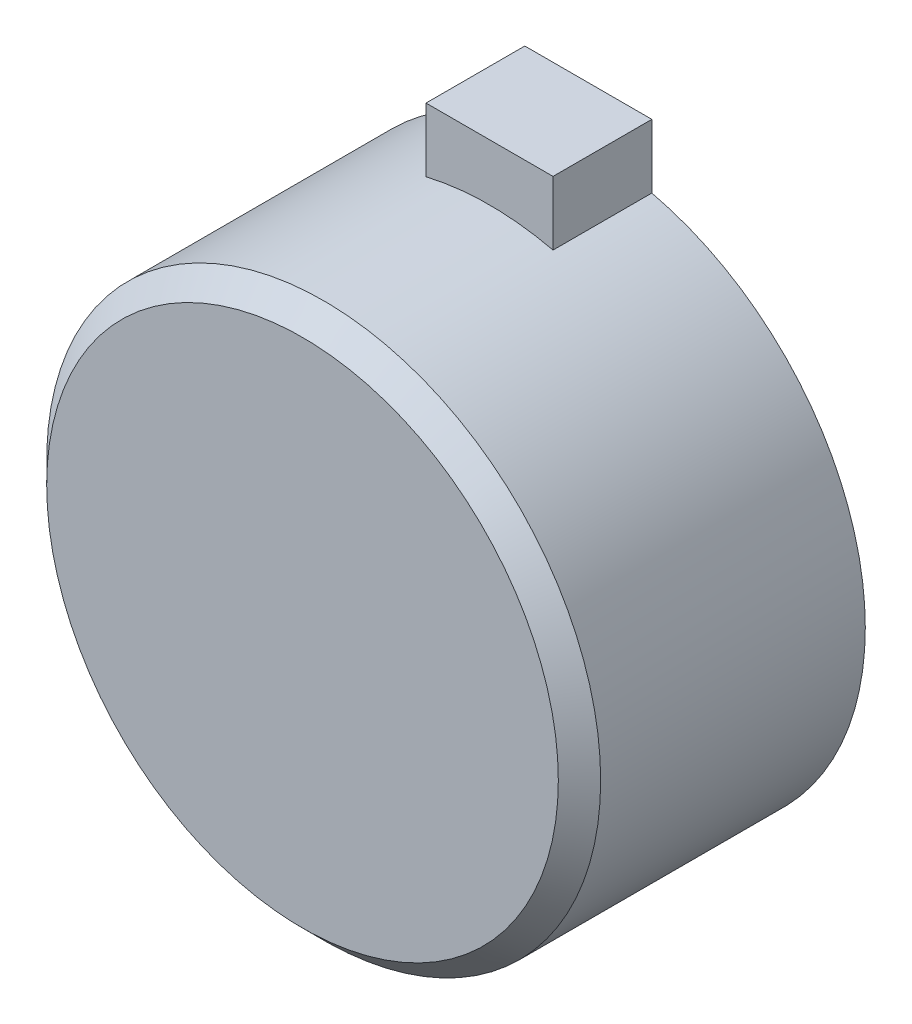
ISO-10303-21;
HEADER;
FILE_DESCRIPTION(('STEP AP214'),'2;1');
FILE_NAME('part.step','',(''),(''),'','','');
FILE_SCHEMA(('AUTOMOTIVE_DESIGN { 1 0 10303 214 1 1 1 1 }'));
ENDSEC;
DATA;
#1=APPLICATION_CONTEXT('core data for automotive mechanical design processes');
#2=APPLICATION_PROTOCOL_DEFINITION('international standard','automotive_design',2000,#1);
#3=PRODUCT_CONTEXT('',#1,'mechanical');
#4=PRODUCT('Part','Part','',(#3));
#5=PRODUCT_RELATED_PRODUCT_CATEGORY('part','',(#4));
#6=PRODUCT_DEFINITION_FORMATION('','',#4);
#7=PRODUCT_DEFINITION_CONTEXT('part definition',#1,'design');
#8=PRODUCT_DEFINITION('design','',#6,#7);
#9=PRODUCT_DEFINITION_SHAPE('','',#8);
#10=(LENGTH_UNIT() NAMED_UNIT(*) SI_UNIT(.MILLI.,.METRE.));
#11=(NAMED_UNIT(*) PLANE_ANGLE_UNIT() SI_UNIT($,.RADIAN.));
#12=(NAMED_UNIT(*) SI_UNIT($,.STERADIAN.) SOLID_ANGLE_UNIT());
#13=UNCERTAINTY_MEASURE_WITH_UNIT(LENGTH_MEASURE(1.E-05),#10,'distance_accuracy_value','');
#14=(GEOMETRIC_REPRESENTATION_CONTEXT(3) GLOBAL_UNCERTAINTY_ASSIGNED_CONTEXT((#13)) GLOBAL_UNIT_ASSIGNED_CONTEXT((#10,
#11,#12)) REPRESENTATION_CONTEXT('',''));
#15=CARTESIAN_POINT('',(0.,0.,0.));
#16=DIRECTION('',(0.,0.,1.));
#17=DIRECTION('',(1.,0.,0.));
#18=AXIS2_PLACEMENT_3D('',#15,#16,#17);
#19=CARTESIAN_POINT('',(0.,0.,10.));
#20=DIRECTION('',(0.,0.,1.));
#21=DIRECTION('',(1.,0.,0.));
#22=AXIS2_PLACEMENT_3D('',#19,#20,#21);
#23=CYLINDRICAL_SURFACE('',#22,39.25);
#24=CARTESIAN_POINT('',(0.,0.,-3.));
#25=DIRECTION('',(0.,0.,1.));
#26=DIRECTION('',(1.,0.,0.));
#27=AXIS2_PLACEMENT_3D('',#24,#25,#26);
#28=CIRCLE('',#27,39.25);
#29=CARTESIAN_POINT('',(39.25,0.,-3.));
#30=VERTEX_POINT('',#29);
#31=EDGE_CURVE('E149',#30,#30,#28,.T.);
#32=ORIENTED_EDGE('',*,*,#31,.F.);
#33=EDGE_LOOP('',(#32));
#34=FACE_BOUND('',#33,.T.);
#35=CARTESIAN_POINT('',(0.,0.,-26.5));
#36=DIRECTION('',(0.,0.,1.));
#37=DIRECTION('',(1.,0.,0.));
#38=AXIS2_PLACEMENT_3D('',#35,#36,#37);
#39=CIRCLE('',#38,39.25);
#40=CARTESIAN_POINT('',(-9.,38.204220970987,-26.5));
#41=VERTEX_POINT('',#40);
#42=CARTESIAN_POINT('',(9.,38.204220970987,-26.5));
#43=VERTEX_POINT('',#42);
#44=EDGE_CURVE('E11',#41,#43,#39,.F.);
#45=ORIENTED_EDGE('',*,*,#44,.F.);
#46=DIRECTION('',(0.,0.,1.));
#47=VECTOR('',#46,1.);
#48=CARTESIAN_POINT('',(-9.,38.204220970987,10.));
#49=LINE('',#48,#47);
#50=CARTESIAN_POINT('',(-9.,38.204220970987,-40.5));
#51=VERTEX_POINT('',#50);
#52=EDGE_CURVE('E57',#41,#51,#49,.F.);
#53=ORIENTED_EDGE('',*,*,#52,.T.);
#54=CARTESIAN_POINT('',(0.,0.,-40.5));
#55=DIRECTION('',(0.,0.,1.));
#56=DIRECTION('',(1.,0.,0.));
#57=AXIS2_PLACEMENT_3D('',#54,#55,#56);
#58=CIRCLE('',#57,39.25);
#59=CARTESIAN_POINT('',(9.,38.204220970987,-40.5));
#60=VERTEX_POINT('',#59);
#61=EDGE_CURVE('E144',#51,#60,#58,.T.);
#62=ORIENTED_EDGE('',*,*,#61,.T.);
#63=DIRECTION('',(0.,0.,1.));
#64=VECTOR('',#63,1.);
#65=CARTESIAN_POINT('',(9.,38.204220970987,10.));
#66=LINE('',#65,#64);
#67=EDGE_CURVE('E91',#60,#43,#66,.T.);
#68=ORIENTED_EDGE('',*,*,#67,.T.);
#69=EDGE_LOOP('',(#45,#53,#62,#68));
#70=FACE_BOUND('',#69,.T.);
#71=ADVANCED_FACE('F39',(#34,#70),#23,.T.);
#72=CARTESIAN_POINT('',(0.,0.,0.));
#73=DIRECTION('',(0.,0.,1.));
#74=DIRECTION('',(1.,0.,0.));
#75=AXIS2_PLACEMENT_3D('',#72,#73,#74);
#76=PLANE('',#75);
#77=CARTESIAN_POINT('',(0.,0.,0.));
#78=DIRECTION('',(0.,0.,1.));
#79=DIRECTION('',(1.,0.,0.));
#80=AXIS2_PLACEMENT_3D('',#77,#78,#79);
#81=CIRCLE('',#80,36.25);
#82=CARTESIAN_POINT('',(36.25,0.,0.));
#83=VERTEX_POINT('',#82);
#84=EDGE_CURVE('E50',#83,#83,#81,.T.);
#85=ORIENTED_EDGE('',*,*,#84,.T.);
#86=EDGE_LOOP('',(#85));
#87=FACE_BOUND('',#86,.T.);
#88=ADVANCED_FACE('F41',(#87),#76,.T.);
#89=CARTESIAN_POINT('',(0.,0.,0.));
#90=DIRECTION('',(0.,0.,-1.));
#91=DIRECTION('',(-1.,0.,0.));
#92=AXIS2_PLACEMENT_3D('',#89,#90,#91);
#93=CONICAL_SURFACE('',#92,36.25,0.785398163397449);
#94=ORIENTED_EDGE('',*,*,#31,.T.);
#95=EDGE_LOOP('',(#94));
#96=FACE_BOUND('',#95,.T.);
#97=ORIENTED_EDGE('',*,*,#84,.F.);
#98=EDGE_LOOP('',(#97));
#99=FACE_BOUND('',#98,.T.);
#100=ADVANCED_FACE('F154',(#96,#99),#93,.T.);
#101=CARTESIAN_POINT('',(36.25,0.,-40.5));
#102=DIRECTION('',(0.,0.,-1.));
#103=DIRECTION('',(-1.,0.,0.));
#104=AXIS2_PLACEMENT_3D('',#101,#102,#103);
#105=PLANE('',#104);
#106=ORIENTED_EDGE('',*,*,#61,.F.);
#107=DIRECTION('',(0.,-1.,0.));
#108=VECTOR('',#107,1.);
#109=CARTESIAN_POINT('',(-9.,47.25,-40.5));
#110=LINE('',#109,#108);
#111=CARTESIAN_POINT('',(-9.,47.25,-40.5));
#112=VERTEX_POINT('',#111);
#113=EDGE_CURVE('E103',#112,#51,#110,.T.);
#114=ORIENTED_EDGE('',*,*,#113,.F.);
#115=DIRECTION('',(-1.,0.,0.));
#116=VECTOR('',#115,1.);
#117=CARTESIAN_POINT('',(9.,47.25,-40.5));
#118=LINE('',#117,#116);
#119=CARTESIAN_POINT('',(9.,47.25,-40.5));
#120=VERTEX_POINT('',#119);
#121=EDGE_CURVE('E110',#120,#112,#118,.T.);
#122=ORIENTED_EDGE('',*,*,#121,.F.);
#123=DIRECTION('',(0.,1.,0.));
#124=VECTOR('',#123,1.);
#125=CARTESIAN_POINT('',(9.,35.25,-40.5));
#126=LINE('',#125,#124);
#127=EDGE_CURVE('E89',#60,#120,#126,.T.);
#128=ORIENTED_EDGE('',*,*,#127,.F.);
#129=EDGE_LOOP('',(#106,#114,#122,#128));
#130=FACE_BOUND('',#129,.T.);
#131=CARTESIAN_POINT('',(16.5,-28.5788383248865,-40.5));
#132=DIRECTION('',(0.,0.,1.));
#133=DIRECTION('',(0.499999999999999,-0.866025403784439,0.));
#134=AXIS2_PLACEMENT_3D('',#131,#132,#133);
#135=CIRCLE('',#134,1.25);
#136=CARTESIAN_POINT('',(17.125,-29.661370079617,-40.5));
#137=VERTEX_POINT('',#136);
#138=EDGE_CURVE('E112',#137,#137,#135,.T.);
#139=ORIENTED_EDGE('',*,*,#138,.T.);
#140=EDGE_LOOP('',(#139));
#141=FACE_BOUND('',#140,.T.);
#142=CARTESIAN_POINT('',(-16.5,-28.5788383248865,-40.5));
#143=DIRECTION('',(0.,0.,1.));
#144=DIRECTION('',(-0.5,-0.866025403784438,0.));
#145=AXIS2_PLACEMENT_3D('',#142,#143,#144);
#146=CIRCLE('',#145,1.25);
#147=CARTESIAN_POINT('',(-17.125,-29.661370079617,-40.5));
#148=VERTEX_POINT('',#147);
#149=EDGE_CURVE('E126',#148,#148,#146,.T.);
#150=ORIENTED_EDGE('',*,*,#149,.T.);
#151=EDGE_LOOP('',(#150));
#152=FACE_BOUND('',#151,.T.);
#153=CARTESIAN_POINT('',(-33.,0.,-40.5));
#154=DIRECTION('',(0.,0.,1.));
#155=DIRECTION('',(-1.,0.,0.));
#156=AXIS2_PLACEMENT_3D('',#153,#154,#155);
#157=CIRCLE('',#156,1.25);
#158=CARTESIAN_POINT('',(-34.25,0.,-40.5));
#159=VERTEX_POINT('',#158);
#160=EDGE_CURVE('E122',#159,#159,#157,.T.);
#161=ORIENTED_EDGE('',*,*,#160,.T.);
#162=EDGE_LOOP('',(#161));
#163=FACE_BOUND('',#162,.T.);
#164=CARTESIAN_POINT('',(-16.5,28.5788383248865,-40.5));
#165=DIRECTION('',(0.,0.,1.));
#166=DIRECTION('',(-0.5,0.866025403784439,0.));
#167=AXIS2_PLACEMENT_3D('',#164,#165,#166);
#168=CIRCLE('',#167,1.25);
#169=CARTESIAN_POINT('',(-17.125,29.661370079617,-40.5));
#170=VERTEX_POINT('',#169);
#171=EDGE_CURVE('E119',#170,#170,#168,.T.);
#172=ORIENTED_EDGE('',*,*,#171,.T.);
#173=EDGE_LOOP('',(#172));
#174=FACE_BOUND('',#173,.T.);
#175=CARTESIAN_POINT('',(16.5,28.5788383248865,-40.5));
#176=DIRECTION('',(0.,0.,1.));
#177=DIRECTION('',(0.5,0.866025403784439,0.));
#178=AXIS2_PLACEMENT_3D('',#175,#176,#177);
#179=CIRCLE('',#178,1.25);
#180=CARTESIAN_POINT('',(17.125,29.661370079617,-40.5));
#181=VERTEX_POINT('',#180);
#182=EDGE_CURVE('E113',#181,#181,#179,.T.);
#183=ORIENTED_EDGE('',*,*,#182,.T.);
#184=EDGE_LOOP('',(#183));
#185=FACE_BOUND('',#184,.T.);
#186=CARTESIAN_POINT('',(33.,0.,-40.5));
#187=DIRECTION('',(0.,0.,1.));
#188=DIRECTION('',(1.,0.,0.));
#189=AXIS2_PLACEMENT_3D('',#186,#187,#188);
#190=CIRCLE('',#189,1.25);
#191=CARTESIAN_POINT('',(34.25,0.,-40.5));
#192=VERTEX_POINT('',#191);
#193=EDGE_CURVE('E138',#192,#192,#190,.T.);
#194=ORIENTED_EDGE('',*,*,#193,.T.);
#195=EDGE_LOOP('',(#194));
#196=FACE_BOUND('',#195,.T.);
#197=ADVANCED_FACE('F160',(#130,#141,#152,#163,#174,#185,#196),#105,.T.);
#198=CARTESIAN_POINT('',(33.,0.,-32.5));
#199=DIRECTION('',(0.,0.,-1.));
#200=DIRECTION('',(-1.,0.,0.));
#201=AXIS2_PLACEMENT_3D('',#198,#199,#200);
#202=CYLINDRICAL_SURFACE('',#201,1.25);
#203=CARTESIAN_POINT('',(33.,0.,-32.5));
#204=DIRECTION('',(0.,0.,1.));
#205=DIRECTION('',(1.,0.,0.));
#206=AXIS2_PLACEMENT_3D('',#203,#204,#205);
#207=CIRCLE('',#206,1.25);
#208=CARTESIAN_POINT('',(34.25,0.,-32.5));
#209=VERTEX_POINT('',#208);
#210=EDGE_CURVE('E142',#209,#209,#207,.T.);
#211=ORIENTED_EDGE('',*,*,#210,.T.);
#212=EDGE_LOOP('',(#211));
#213=FACE_BOUND('',#212,.T.);
#214=ORIENTED_EDGE('',*,*,#193,.F.);
#215=EDGE_LOOP('',(#214));
#216=FACE_BOUND('',#215,.T.);
#217=ADVANCED_FACE('F163',(#213,#216),#202,.F.);
#218=CARTESIAN_POINT('',(33.,0.,-32.5));
#219=DIRECTION('',(0.,0.,1.));
#220=DIRECTION('',(1.,0.,0.));
#221=AXIS2_PLACEMENT_3D('',#218,#219,#220);
#222=PLANE('',#221);
#223=ORIENTED_EDGE('',*,*,#210,.F.);
#224=EDGE_LOOP('',(#223));
#225=FACE_BOUND('',#224,.T.);
#226=ADVANCED_FACE('F176',(#225),#222,.F.);
#227=CARTESIAN_POINT('',(16.5,28.5788383248865,-32.5));
#228=DIRECTION('',(0.,0.,-1.));
#229=DIRECTION('',(-1.,0.,0.));
#230=AXIS2_PLACEMENT_3D('',#227,#228,#229);
#231=CYLINDRICAL_SURFACE('',#230,1.25);
#232=CARTESIAN_POINT('',(16.5,28.5788383248865,-32.5));
#233=DIRECTION('',(0.,0.,1.));
#234=DIRECTION('',(0.5,0.866025403784439,0.));
#235=AXIS2_PLACEMENT_3D('',#232,#233,#234);
#236=CIRCLE('',#235,1.25);
#237=CARTESIAN_POINT('',(17.125,29.661370079617,-32.5));
#238=VERTEX_POINT('',#237);
#239=EDGE_CURVE('E136',#238,#238,#236,.T.);
#240=ORIENTED_EDGE('',*,*,#239,.T.);
#241=EDGE_LOOP('',(#240));
#242=FACE_BOUND('',#241,.T.);
#243=ORIENTED_EDGE('',*,*,#182,.F.);
#244=EDGE_LOOP('',(#243));
#245=FACE_BOUND('',#244,.T.);
#246=ADVANCED_FACE('F180',(#242,#245),#231,.F.);
#247=CARTESIAN_POINT('',(16.5,28.5788383248865,-32.5));
#248=DIRECTION('',(0.,0.,1.));
#249=DIRECTION('',(0.5,0.866025403784439,0.));
#250=AXIS2_PLACEMENT_3D('',#247,#248,#249);
#251=PLANE('',#250);
#252=ORIENTED_EDGE('',*,*,#239,.F.);
#253=EDGE_LOOP('',(#252));
#254=FACE_BOUND('',#253,.T.);
#255=ADVANCED_FACE('F184',(#254),#251,.F.);
#256=CARTESIAN_POINT('',(-16.5,28.5788383248865,-32.5));
#257=DIRECTION('',(0.,0.,-1.));
#258=DIRECTION('',(-1.,0.,0.));
#259=AXIS2_PLACEMENT_3D('',#256,#257,#258);
#260=CYLINDRICAL_SURFACE('',#259,1.25);
#261=CARTESIAN_POINT('',(-16.5,28.5788383248865,-32.5));
#262=DIRECTION('',(0.,0.,1.));
#263=DIRECTION('',(-0.5,0.866025403784439,0.));
#264=AXIS2_PLACEMENT_3D('',#261,#262,#263);
#265=CIRCLE('',#264,1.25);
#266=CARTESIAN_POINT('',(-17.125,29.661370079617,-32.5));
#267=VERTEX_POINT('',#266);
#268=EDGE_CURVE('E115',#267,#267,#265,.T.);
#269=ORIENTED_EDGE('',*,*,#268,.T.);
#270=EDGE_LOOP('',(#269));
#271=FACE_BOUND('',#270,.T.);
#272=ORIENTED_EDGE('',*,*,#171,.F.);
#273=EDGE_LOOP('',(#272));
#274=FACE_BOUND('',#273,.T.);
#275=ADVANCED_FACE('F190',(#271,#274),#260,.F.);
#276=CARTESIAN_POINT('',(-16.5,28.5788383248865,-32.5));
#277=DIRECTION('',(0.,0.,1.));
#278=DIRECTION('',(-0.5,0.866025403784439,0.));
#279=AXIS2_PLACEMENT_3D('',#276,#277,#278);
#280=PLANE('',#279);
#281=ORIENTED_EDGE('',*,*,#268,.F.);
#282=EDGE_LOOP('',(#281));
#283=FACE_BOUND('',#282,.T.);
#284=ADVANCED_FACE('F209',(#283),#280,.F.);
#285=CARTESIAN_POINT('',(-33.,0.,-32.5));
#286=DIRECTION('',(0.,0.,-1.));
#287=DIRECTION('',(-1.,0.,0.));
#288=AXIS2_PLACEMENT_3D('',#285,#286,#287);
#289=CYLINDRICAL_SURFACE('',#288,1.25);
#290=CARTESIAN_POINT('',(-33.,0.,-32.5));
#291=DIRECTION('',(0.,0.,1.));
#292=DIRECTION('',(-1.,0.,0.));
#293=AXIS2_PLACEMENT_3D('',#290,#291,#292);
#294=CIRCLE('',#293,1.25);
#295=CARTESIAN_POINT('',(-34.25,0.,-32.5));
#296=VERTEX_POINT('',#295);
#297=EDGE_CURVE('E118',#296,#296,#294,.T.);
#298=ORIENTED_EDGE('',*,*,#297,.T.);
#299=EDGE_LOOP('',(#298));
#300=FACE_BOUND('',#299,.T.);
#301=ORIENTED_EDGE('',*,*,#160,.F.);
#302=EDGE_LOOP('',(#301));
#303=FACE_BOUND('',#302,.T.);
#304=ADVANCED_FACE('F210',(#300,#303),#289,.F.);
#305=CARTESIAN_POINT('',(-33.,0.,-32.5));
#306=DIRECTION('',(0.,0.,1.));
#307=DIRECTION('',(-1.,0.,0.));
#308=AXIS2_PLACEMENT_3D('',#305,#306,#307);
#309=PLANE('',#308);
#310=ORIENTED_EDGE('',*,*,#297,.F.);
#311=EDGE_LOOP('',(#310));
#312=FACE_BOUND('',#311,.T.);
#313=ADVANCED_FACE('F205',(#312),#309,.F.);
#314=CARTESIAN_POINT('',(-16.5,-28.5788383248865,-32.5));
#315=DIRECTION('',(0.,0.,-1.));
#316=DIRECTION('',(-1.,0.,0.));
#317=AXIS2_PLACEMENT_3D('',#314,#315,#316);
#318=CYLINDRICAL_SURFACE('',#317,1.25);
#319=CARTESIAN_POINT('',(-16.5,-28.5788383248865,-32.5));
#320=DIRECTION('',(0.,0.,1.));
#321=DIRECTION('',(-0.5,-0.866025403784438,0.));
#322=AXIS2_PLACEMENT_3D('',#319,#320,#321);
#323=CIRCLE('',#322,1.25);
#324=CARTESIAN_POINT('',(-17.125,-29.661370079617,-32.5));
#325=VERTEX_POINT('',#324);
#326=EDGE_CURVE('E125',#325,#325,#323,.T.);
#327=ORIENTED_EDGE('',*,*,#326,.T.);
#328=EDGE_LOOP('',(#327));
#329=FACE_BOUND('',#328,.T.);
#330=ORIENTED_EDGE('',*,*,#149,.F.);
#331=EDGE_LOOP('',(#330));
#332=FACE_BOUND('',#331,.T.);
#333=ADVANCED_FACE('F200',(#329,#332),#318,.F.);
#334=CARTESIAN_POINT('',(-16.5,-28.5788383248865,-32.5));
#335=DIRECTION('',(0.,0.,1.));
#336=DIRECTION('',(-0.5,-0.866025403784438,0.));
#337=AXIS2_PLACEMENT_3D('',#334,#335,#336);
#338=PLANE('',#337);
#339=ORIENTED_EDGE('',*,*,#326,.F.);
#340=EDGE_LOOP('',(#339));
#341=FACE_BOUND('',#340,.T.);
#342=ADVANCED_FACE('F193',(#341),#338,.F.);
#343=CARTESIAN_POINT('',(16.5,-28.5788383248865,-32.5));
#344=DIRECTION('',(0.,0.,-1.));
#345=DIRECTION('',(-1.,0.,0.));
#346=AXIS2_PLACEMENT_3D('',#343,#344,#345);
#347=CYLINDRICAL_SURFACE('',#346,1.25);
#348=CARTESIAN_POINT('',(16.5,-28.5788383248865,-32.5));
#349=DIRECTION('',(0.,0.,1.));
#350=DIRECTION('',(0.499999999999999,-0.866025403784439,0.));
#351=AXIS2_PLACEMENT_3D('',#348,#349,#350);
#352=CIRCLE('',#351,1.25);
#353=CARTESIAN_POINT('',(17.125,-29.661370079617,-32.5));
#354=VERTEX_POINT('',#353);
#355=EDGE_CURVE('E134',#354,#354,#352,.T.);
#356=ORIENTED_EDGE('',*,*,#355,.T.);
#357=EDGE_LOOP('',(#356));
#358=FACE_BOUND('',#357,.T.);
#359=ORIENTED_EDGE('',*,*,#138,.F.);
#360=EDGE_LOOP('',(#359));
#361=FACE_BOUND('',#360,.T.);
#362=ADVANCED_FACE('F187',(#358,#361),#347,.F.);
#363=CARTESIAN_POINT('',(16.5,-28.5788383248865,-32.5));
#364=DIRECTION('',(0.,0.,1.));
#365=DIRECTION('',(0.499999999999999,-0.866025403784439,0.));
#366=AXIS2_PLACEMENT_3D('',#363,#364,#365);
#367=PLANE('',#366);
#368=ORIENTED_EDGE('',*,*,#355,.F.);
#369=EDGE_LOOP('',(#368));
#370=FACE_BOUND('',#369,.T.);
#371=ADVANCED_FACE('F194',(#370),#367,.F.);
#372=CARTESIAN_POINT('',(-9.,47.25,-26.5));
#373=DIRECTION('',(1.,0.,0.));
#374=DIRECTION('',(0.,0.,-1.));
#375=AXIS2_PLACEMENT_3D('',#372,#373,#374);
#376=PLANE('',#375);
#377=ORIENTED_EDGE('',*,*,#52,.F.);
#378=DIRECTION('',(0.,-1.,0.));
#379=VECTOR('',#378,1.);
#380=CARTESIAN_POINT('',(-9.,47.25,-26.5));
#381=LINE('',#380,#379);
#382=CARTESIAN_POINT('',(-9.,47.25,-26.5));
#383=VERTEX_POINT('',#382);
#384=EDGE_CURVE('E83',#383,#41,#381,.T.);
#385=ORIENTED_EDGE('',*,*,#384,.F.);
#386=DIRECTION('',(0.,0.,-1.));
#387=VECTOR('',#386,1.);
#388=CARTESIAN_POINT('',(-9.,47.25,-26.5));
#389=LINE('',#388,#387);
#390=EDGE_CURVE('E94',#383,#112,#389,.T.);
#391=ORIENTED_EDGE('',*,*,#390,.T.);
#392=ORIENTED_EDGE('',*,*,#113,.T.);
#393=EDGE_LOOP('',(#377,#385,#391,#392));
#394=FACE_BOUND('',#393,.T.);
#395=ADVANCED_FACE('F197',(#394),#376,.F.);
#396=CARTESIAN_POINT('',(9.,35.25,-26.5));
#397=DIRECTION('',(-1.,0.,0.));
#398=DIRECTION('',(0.,0.,1.));
#399=AXIS2_PLACEMENT_3D('',#396,#397,#398);
#400=PLANE('',#399);
#401=ORIENTED_EDGE('',*,*,#67,.F.);
#402=ORIENTED_EDGE('',*,*,#127,.T.);
#403=DIRECTION('',(0.,0.,-1.));
#404=VECTOR('',#403,1.);
#405=CARTESIAN_POINT('',(9.,47.25,-26.5));
#406=LINE('',#405,#404);
#407=CARTESIAN_POINT('',(9.,47.25,-26.5));
#408=VERTEX_POINT('',#407);
#409=EDGE_CURVE('E87',#408,#120,#406,.T.);
#410=ORIENTED_EDGE('',*,*,#409,.F.);
#411=DIRECTION('',(0.,1.,0.));
#412=VECTOR('',#411,1.);
#413=CARTESIAN_POINT('',(9.,35.25,-26.5));
#414=LINE('',#413,#412);
#415=EDGE_CURVE('E73',#43,#408,#414,.T.);
#416=ORIENTED_EDGE('',*,*,#415,.F.);
#417=EDGE_LOOP('',(#401,#402,#410,#416));
#418=FACE_BOUND('',#417,.T.);
#419=ADVANCED_FACE('F86',(#418),#400,.F.);
#420=CARTESIAN_POINT('',(9.,47.25,-26.5));
#421=DIRECTION('',(0.,-1.,0.));
#422=DIRECTION('',(0.,0.,-1.));
#423=AXIS2_PLACEMENT_3D('',#420,#421,#422);
#424=PLANE('',#423);
#425=ORIENTED_EDGE('',*,*,#121,.T.);
#426=ORIENTED_EDGE('',*,*,#390,.F.);
#427=DIRECTION('',(-1.,0.,0.));
#428=VECTOR('',#427,1.);
#429=CARTESIAN_POINT('',(9.,47.25,-26.5));
#430=LINE('',#429,#428);
#431=EDGE_CURVE('E77',#408,#383,#430,.T.);
#432=ORIENTED_EDGE('',*,*,#431,.F.);
#433=ORIENTED_EDGE('',*,*,#409,.T.);
#434=EDGE_LOOP('',(#425,#426,#432,#433));
#435=FACE_BOUND('',#434,.T.);
#436=ADVANCED_FACE('F96',(#435),#424,.F.);
#437=CARTESIAN_POINT('',(0.,0.,-26.5));
#438=DIRECTION('',(0.,0.,1.));
#439=DIRECTION('',(1.,0.,0.));
#440=AXIS2_PLACEMENT_3D('',#437,#438,#439);
#441=PLANE('',#440);
#442=ORIENTED_EDGE('',*,*,#384,.T.);
#443=ORIENTED_EDGE('',*,*,#44,.T.);
#444=ORIENTED_EDGE('',*,*,#415,.T.);
#445=ORIENTED_EDGE('',*,*,#431,.T.);
#446=EDGE_LOOP('',(#442,#443,#444,#445));
#447=FACE_BOUND('',#446,.T.);
#448=ADVANCED_FACE('F80',(#447),#441,.T.);
#449=CLOSED_SHELL('',(#71,#88,#100,#197,#217,#226,#246,#255,#275,#284,#304,#313,#333,#342,#362,
#371,#395,#419,#436,#448));
#450=MANIFOLD_SOLID_BREP('B2',#449);
#451=ADVANCED_BREP_SHAPE_REPRESENTATION('',(#18,#450),#14);
#452=SHAPE_DEFINITION_REPRESENTATION(#9,#451);
ENDSEC;
END-ISO-10303-21;
